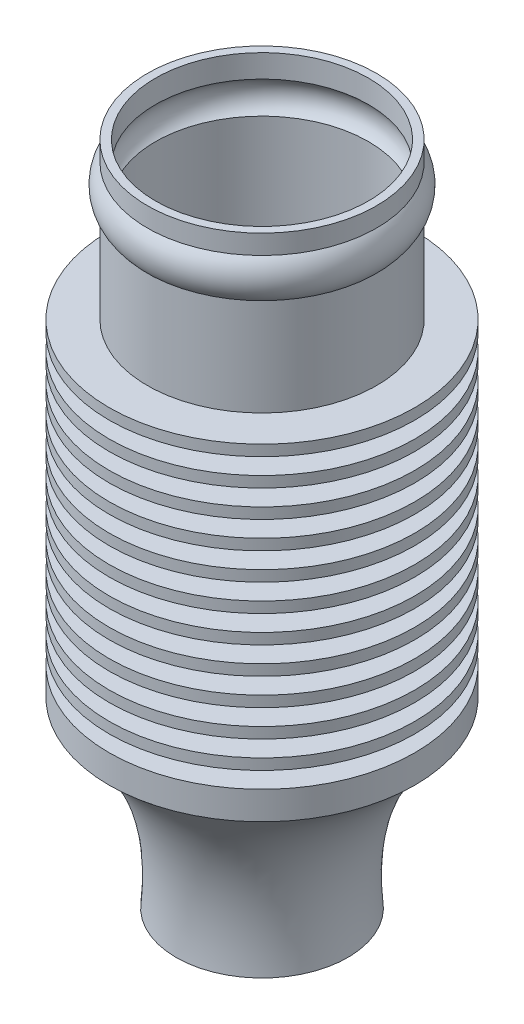
ISO-10303-21;
HEADER;
FILE_DESCRIPTION(('STEP AP214'),'2;1');
FILE_NAME('part.step','',(''),(''),'','','');
FILE_SCHEMA(('AUTOMOTIVE_DESIGN { 1 0 10303 214 1 1 1 1 }'));
ENDSEC;
DATA;
#1=APPLICATION_CONTEXT('core data for automotive mechanical design processes');
#2=APPLICATION_PROTOCOL_DEFINITION('international standard','automotive_design',2000,#1);
#3=PRODUCT_CONTEXT('',#1,'mechanical');
#4=PRODUCT('Part','Part','',(#3));
#5=PRODUCT_RELATED_PRODUCT_CATEGORY('part','',(#4));
#6=PRODUCT_DEFINITION_FORMATION('','',#4);
#7=PRODUCT_DEFINITION_CONTEXT('part definition',#1,'design');
#8=PRODUCT_DEFINITION('design','',#6,#7);
#9=PRODUCT_DEFINITION_SHAPE('','',#8);
#10=(LENGTH_UNIT() NAMED_UNIT(*) SI_UNIT(.MILLI.,.METRE.));
#11=(NAMED_UNIT(*) PLANE_ANGLE_UNIT() SI_UNIT($,.RADIAN.));
#12=(NAMED_UNIT(*) SI_UNIT($,.STERADIAN.) SOLID_ANGLE_UNIT());
#13=UNCERTAINTY_MEASURE_WITH_UNIT(LENGTH_MEASURE(1.E-05),#10,'distance_accuracy_value','');
#14=(GEOMETRIC_REPRESENTATION_CONTEXT(3) GLOBAL_UNCERTAINTY_ASSIGNED_CONTEXT((#13)) GLOBAL_UNIT_ASSIGNED_CONTEXT((#10,
#11,#12)) REPRESENTATION_CONTEXT('',''));
#15=CARTESIAN_POINT('',(0.,0.,0.));
#16=DIRECTION('',(0.,0.,1.));
#17=DIRECTION('',(1.,0.,0.));
#18=AXIS2_PLACEMENT_3D('',#15,#16,#17);
#19=CARTESIAN_POINT('',(0.,0.,0.));
#20=DIRECTION('',(0.,1.,0.));
#21=DIRECTION('',(0.,0.,1.));
#22=AXIS2_PLACEMENT_3D('',#19,#20,#21);
#23=PLANE('',#22);
#24=CARTESIAN_POINT('',(0.,0.,0.));
#25=DIRECTION('',(0.,1.,0.));
#26=DIRECTION('',(0.,0.,1.));
#27=AXIS2_PLACEMENT_3D('',#24,#25,#26);
#28=CIRCLE('',#27,15.8018274363557);
#29=CARTESIAN_POINT('',(0.,0.,15.8018274363557));
#30=VERTEX_POINT('',#29);
#31=EDGE_CURVE('E10',#30,#30,#28,.T.);
#32=ORIENTED_EDGE('',*,*,#31,.F.);
#33=EDGE_LOOP('',(#32));
#34=FACE_BOUND('',#33,.T.);
#35=ADVANCED_FACE('F39',(#34),#23,.F.);
#36=CARTESIAN_POINT('',(15.8018274363557,0.,0.));
#37=CARTESIAN_POINT('',(13.7828030477477,22.3811675355133,0.));
#38=CARTESIAN_POINT('',(28.1218962850397,33.6123617502142,0.));
#39=B_SPLINE_CURVE_WITH_KNOTS('',2,(#36,#37,#38),.UNSPECIFIED.,.F.,.F.,(3,3),(0.,1.),.UNSPECIFIED.);
#40=CARTESIAN_POINT('',(0.,33.6123617502142,0.));
#41=DIRECTION('',(0.,1.,0.));
#42=AXIS1_PLACEMENT('',#40,#41);
#43=SURFACE_OF_REVOLUTION('',#39,#42);
#44=CARTESIAN_POINT('',(0.,33.6123617502142,0.));
#45=DIRECTION('',(0.,1.,0.));
#46=DIRECTION('',(0.,0.,1.));
#47=AXIS2_PLACEMENT_3D('',#44,#45,#46);
#48=CIRCLE('',#47,28.1218962850397);
#49=CARTESIAN_POINT('',(0.,33.6123617502142,28.1218962850397));
#50=VERTEX_POINT('',#49);
#51=EDGE_CURVE('E46',#50,#50,#48,.T.);
#52=ORIENTED_EDGE('',*,*,#51,.F.);
#53=EDGE_LOOP('',(#52));
#54=FACE_BOUND('',#53,.T.);
#55=ORIENTED_EDGE('',*,*,#31,.T.);
#56=EDGE_LOOP('',(#55));
#57=FACE_BOUND('',#56,.T.);
#58=ADVANCED_FACE('F150',(#54,#57),#43,.T.);
#59=CARTESIAN_POINT('',(0.,33.6123617502142,0.));
#60=DIRECTION('',(0.,-1.,0.));
#61=DIRECTION('',(0.,0.,-1.));
#62=AXIS2_PLACEMENT_3D('',#59,#60,#61);
#63=CYLINDRICAL_SURFACE('',#62,28.1218962850397);
#64=CARTESIAN_POINT('',(0.,38.7911166699927,0.));
#65=DIRECTION('',(0.,-1.,0.));
#66=DIRECTION('',(0.,0.,-1.));
#67=AXIS2_PLACEMENT_3D('',#64,#65,#66);
#68=CIRCLE('',#67,28.1218962850397);
#69=CARTESIAN_POINT('',(0.,38.7911166699927,-28.1218962850397));
#70=VERTEX_POINT('',#69);
#71=EDGE_CURVE('E54',#70,#70,#68,.F.);
#72=ORIENTED_EDGE('',*,*,#71,.F.);
#73=EDGE_LOOP('',(#72));
#74=FACE_BOUND('',#73,.T.);
#75=ORIENTED_EDGE('',*,*,#51,.T.);
#76=EDGE_LOOP('',(#75));
#77=FACE_BOUND('',#76,.T.);
#78=ADVANCED_FACE('F133',(#74,#77),#63,.T.);
#79=CARTESIAN_POINT('',(21.0988467211793,41.7911166699927,0.));
#80=DIRECTION('',(0.,1.,0.));
#81=DIRECTION('',(0.,0.,1.));
#82=AXIS2_PLACEMENT_3D('',#79,#80,#81);
#83=PLANE('',#82);
#84=CARTESIAN_POINT('',(0.,41.7911166699927,0.));
#85=DIRECTION('',(0.,1.,0.));
#86=DIRECTION('',(0.,0.,1.));
#87=AXIS2_PLACEMENT_3D('',#84,#85,#86);
#88=CIRCLE('',#87,28.1218962850397);
#89=CARTESIAN_POINT('',(0.,41.7911166699927,28.1218962850397));
#90=VERTEX_POINT('',#89);
#91=EDGE_CURVE('E57',#90,#90,#88,.F.);
#92=ORIENTED_EDGE('',*,*,#91,.T.);
#93=EDGE_LOOP('',(#92));
#94=FACE_BOUND('',#93,.T.);
#95=CARTESIAN_POINT('',(0.,41.7911166699927,0.));
#96=DIRECTION('',(0.,-1.,0.));
#97=DIRECTION('',(0.,0.,-1.));
#98=AXIS2_PLACEMENT_3D('',#95,#96,#97);
#99=CIRCLE('',#98,21.0988467211793);
#100=CARTESIAN_POINT('',(0.,41.7911166699927,-21.0988467211793));
#101=VERTEX_POINT('',#100);
#102=EDGE_CURVE('E194',#101,#101,#99,.T.);
#103=ORIENTED_EDGE('',*,*,#102,.F.);
#104=EDGE_LOOP('',(#103));
#105=FACE_BOUND('',#104,.T.);
#106=ADVANCED_FACE('F149',(#94,#105),#83,.F.);
#107=CARTESIAN_POINT('',(0.,0.,0.));
#108=DIRECTION('',(0.,-1.,0.));
#109=DIRECTION('',(0.,0.,-1.));
#110=AXIS2_PLACEMENT_3D('',#107,#108,#109);
#111=CYLINDRICAL_SURFACE('',#110,21.0988467211793);
#112=CARTESIAN_POINT('',(0.,38.7911166699927,0.));
#113=DIRECTION('',(0.,-1.,0.));
#114=DIRECTION('',(0.,0.,-1.));
#115=AXIS2_PLACEMENT_3D('',#112,#113,#114);
#116=CIRCLE('',#115,21.0988467211793);
#117=CARTESIAN_POINT('',(0.,38.7911166699927,-21.0988467211793));
#118=VERTEX_POINT('',#117);
#119=EDGE_CURVE('E191',#118,#118,#116,.T.);
#120=ORIENTED_EDGE('',*,*,#119,.F.);
#121=EDGE_LOOP('',(#120));
#122=FACE_BOUND('',#121,.T.);
#123=ORIENTED_EDGE('',*,*,#102,.T.);
#124=EDGE_LOOP('',(#123));
#125=FACE_BOUND('',#124,.T.);
#126=ADVANCED_FACE('F279',(#122,#125),#111,.T.);
#127=CARTESIAN_POINT('',(21.0988467211793,38.7911166699927,0.));
#128=DIRECTION('',(0.,-1.,0.));
#129=DIRECTION('',(0.,0.,-1.));
#130=AXIS2_PLACEMENT_3D('',#127,#128,#129);
#131=PLANE('',#130);
#132=ORIENTED_EDGE('',*,*,#71,.T.);
#133=EDGE_LOOP('',(#132));
#134=FACE_BOUND('',#133,.T.);
#135=ORIENTED_EDGE('',*,*,#119,.T.);
#136=EDGE_LOOP('',(#135));
#137=FACE_BOUND('',#136,.T.);
#138=ADVANCED_FACE('F276',(#134,#137),#131,.F.);
#139=CARTESIAN_POINT('',(0.,43.7911166699927,0.));
#140=DIRECTION('',(0.,-1.,0.));
#141=DIRECTION('',(0.,0.,-1.));
#142=AXIS2_PLACEMENT_3D('',#139,#140,#141);
#143=CIRCLE('',#142,28.1218962850397);
#144=CARTESIAN_POINT('',(0.,43.7911166699927,-28.1218962850397));
#145=VERTEX_POINT('',#144);
#146=EDGE_CURVE('E61',#145,#145,#143,.F.);
#147=ORIENTED_EDGE('',*,*,#146,.F.);
#148=EDGE_LOOP('',(#147));
#149=FACE_BOUND('',#148,.T.);
#150=ORIENTED_EDGE('',*,*,#91,.F.);
#151=EDGE_LOOP('',(#150));
#152=FACE_BOUND('',#151,.T.);
#153=ADVANCED_FACE('F152',(#149,#152),#63,.T.);
#154=CARTESIAN_POINT('',(21.0988467211793,46.7911166699927,0.));
#155=DIRECTION('',(0.,1.,0.));
#156=DIRECTION('',(0.,0.,1.));
#157=AXIS2_PLACEMENT_3D('',#154,#155,#156);
#158=PLANE('',#157);
#159=CARTESIAN_POINT('',(0.,46.7911166699927,0.));
#160=DIRECTION('',(0.,1.,0.));
#161=DIRECTION('',(0.,0.,1.));
#162=AXIS2_PLACEMENT_3D('',#159,#160,#161);
#163=CIRCLE('',#162,28.1218962850397);
#164=CARTESIAN_POINT('',(0.,46.7911166699927,28.1218962850397));
#165=VERTEX_POINT('',#164);
#166=EDGE_CURVE('E64',#165,#165,#163,.F.);
#167=ORIENTED_EDGE('',*,*,#166,.T.);
#168=EDGE_LOOP('',(#167));
#169=FACE_BOUND('',#168,.T.);
#170=CARTESIAN_POINT('',(0.,46.7911166699927,0.));
#171=DIRECTION('',(0.,-1.,0.));
#172=DIRECTION('',(0.,0.,-1.));
#173=AXIS2_PLACEMENT_3D('',#170,#171,#172);
#174=CIRCLE('',#173,21.0988467211793);
#175=CARTESIAN_POINT('',(0.,46.7911166699927,-21.0988467211793));
#176=VERTEX_POINT('',#175);
#177=EDGE_CURVE('E200',#176,#176,#174,.T.);
#178=ORIENTED_EDGE('',*,*,#177,.F.);
#179=EDGE_LOOP('',(#178));
#180=FACE_BOUND('',#179,.T.);
#181=ADVANCED_FACE('F295',(#169,#180),#158,.F.);
#182=CARTESIAN_POINT('',(0.,0.,0.));
#183=DIRECTION('',(0.,-1.,0.));
#184=DIRECTION('',(0.,0.,-1.));
#185=AXIS2_PLACEMENT_3D('',#182,#183,#184);
#186=CYLINDRICAL_SURFACE('',#185,21.0988467211793);
#187=CARTESIAN_POINT('',(0.,43.7911166699927,0.));
#188=DIRECTION('',(0.,-1.,0.));
#189=DIRECTION('',(0.,0.,-1.));
#190=AXIS2_PLACEMENT_3D('',#187,#188,#189);
#191=CIRCLE('',#190,21.0988467211793);
#192=CARTESIAN_POINT('',(0.,43.7911166699927,-21.0988467211793));
#193=VERTEX_POINT('',#192);
#194=EDGE_CURVE('E197',#193,#193,#191,.T.);
#195=ORIENTED_EDGE('',*,*,#194,.F.);
#196=EDGE_LOOP('',(#195));
#197=FACE_BOUND('',#196,.T.);
#198=ORIENTED_EDGE('',*,*,#177,.T.);
#199=EDGE_LOOP('',(#198));
#200=FACE_BOUND('',#199,.T.);
#201=ADVANCED_FACE('F291',(#197,#200),#186,.T.);
#202=CARTESIAN_POINT('',(21.0988467211793,43.7911166699927,0.));
#203=DIRECTION('',(0.,-1.,0.));
#204=DIRECTION('',(0.,0.,-1.));
#205=AXIS2_PLACEMENT_3D('',#202,#203,#204);
#206=PLANE('',#205);
#207=ORIENTED_EDGE('',*,*,#146,.T.);
#208=EDGE_LOOP('',(#207));
#209=FACE_BOUND('',#208,.T.);
#210=ORIENTED_EDGE('',*,*,#194,.T.);
#211=EDGE_LOOP('',(#210));
#212=FACE_BOUND('',#211,.T.);
#213=ADVANCED_FACE('F287',(#209,#212),#206,.F.);
#214=CARTESIAN_POINT('',(0.,48.7911166699927,0.));
#215=DIRECTION('',(0.,-1.,0.));
#216=DIRECTION('',(0.,0.,-1.));
#217=AXIS2_PLACEMENT_3D('',#214,#215,#216);
#218=CIRCLE('',#217,28.1218962850397);
#219=CARTESIAN_POINT('',(0.,48.7911166699927,-28.1218962850397));
#220=VERTEX_POINT('',#219);
#221=EDGE_CURVE('E67',#220,#220,#218,.F.);
#222=ORIENTED_EDGE('',*,*,#221,.F.);
#223=EDGE_LOOP('',(#222));
#224=FACE_BOUND('',#223,.T.);
#225=ORIENTED_EDGE('',*,*,#166,.F.);
#226=EDGE_LOOP('',(#225));
#227=FACE_BOUND('',#226,.T.);
#228=ADVANCED_FACE('F290',(#224,#227),#63,.T.);
#229=CARTESIAN_POINT('',(21.0988467211793,51.7911166699927,0.));
#230=DIRECTION('',(0.,1.,0.));
#231=DIRECTION('',(0.,0.,1.));
#232=AXIS2_PLACEMENT_3D('',#229,#230,#231);
#233=PLANE('',#232);
#234=CARTESIAN_POINT('',(0.,51.7911166699927,0.));
#235=DIRECTION('',(0.,1.,0.));
#236=DIRECTION('',(0.,0.,1.));
#237=AXIS2_PLACEMENT_3D('',#234,#235,#236);
#238=CIRCLE('',#237,28.1218962850397);
#239=CARTESIAN_POINT('',(0.,51.7911166699927,28.1218962850397));
#240=VERTEX_POINT('',#239);
#241=EDGE_CURVE('E70',#240,#240,#238,.F.);
#242=ORIENTED_EDGE('',*,*,#241,.T.);
#243=EDGE_LOOP('',(#242));
#244=FACE_BOUND('',#243,.T.);
#245=CARTESIAN_POINT('',(0.,51.7911166699927,0.));
#246=DIRECTION('',(0.,-1.,0.));
#247=DIRECTION('',(0.,0.,-1.));
#248=AXIS2_PLACEMENT_3D('',#245,#246,#247);
#249=CIRCLE('',#248,21.0988467211793);
#250=CARTESIAN_POINT('',(0.,51.7911166699927,-21.0988467211793));
#251=VERTEX_POINT('',#250);
#252=EDGE_CURVE('E206',#251,#251,#249,.T.);
#253=ORIENTED_EDGE('',*,*,#252,.F.);
#254=EDGE_LOOP('',(#253));
#255=FACE_BOUND('',#254,.T.);
#256=ADVANCED_FACE('F308',(#244,#255),#233,.F.);
#257=CARTESIAN_POINT('',(0.,0.,0.));
#258=DIRECTION('',(0.,-1.,0.));
#259=DIRECTION('',(0.,0.,-1.));
#260=AXIS2_PLACEMENT_3D('',#257,#258,#259);
#261=CYLINDRICAL_SURFACE('',#260,21.0988467211793);
#262=CARTESIAN_POINT('',(0.,48.7911166699927,0.));
#263=DIRECTION('',(0.,-1.,0.));
#264=DIRECTION('',(0.,0.,-1.));
#265=AXIS2_PLACEMENT_3D('',#262,#263,#264);
#266=CIRCLE('',#265,21.0988467211793);
#267=CARTESIAN_POINT('',(0.,48.7911166699927,-21.0988467211793));
#268=VERTEX_POINT('',#267);
#269=EDGE_CURVE('E203',#268,#268,#266,.T.);
#270=ORIENTED_EDGE('',*,*,#269,.F.);
#271=EDGE_LOOP('',(#270));
#272=FACE_BOUND('',#271,.T.);
#273=ORIENTED_EDGE('',*,*,#252,.T.);
#274=EDGE_LOOP('',(#273));
#275=FACE_BOUND('',#274,.T.);
#276=ADVANCED_FACE('F304',(#272,#275),#261,.T.);
#277=CARTESIAN_POINT('',(21.0988467211793,48.7911166699927,0.));
#278=DIRECTION('',(0.,-1.,0.));
#279=DIRECTION('',(0.,0.,-1.));
#280=AXIS2_PLACEMENT_3D('',#277,#278,#279);
#281=PLANE('',#280);
#282=ORIENTED_EDGE('',*,*,#221,.T.);
#283=EDGE_LOOP('',(#282));
#284=FACE_BOUND('',#283,.T.);
#285=ORIENTED_EDGE('',*,*,#269,.T.);
#286=EDGE_LOOP('',(#285));
#287=FACE_BOUND('',#286,.T.);
#288=ADVANCED_FACE('F300',(#284,#287),#281,.F.);
#289=CARTESIAN_POINT('',(0.,53.7911166699927,0.));
#290=DIRECTION('',(0.,-1.,0.));
#291=DIRECTION('',(0.,0.,-1.));
#292=AXIS2_PLACEMENT_3D('',#289,#290,#291);
#293=CIRCLE('',#292,28.1218962850397);
#294=CARTESIAN_POINT('',(0.,53.7911166699927,-28.1218962850397));
#295=VERTEX_POINT('',#294);
#296=EDGE_CURVE('E73',#295,#295,#293,.F.);
#297=ORIENTED_EDGE('',*,*,#296,.F.);
#298=EDGE_LOOP('',(#297));
#299=FACE_BOUND('',#298,.T.);
#300=ORIENTED_EDGE('',*,*,#241,.F.);
#301=EDGE_LOOP('',(#300));
#302=FACE_BOUND('',#301,.T.);
#303=ADVANCED_FACE('F303',(#299,#302),#63,.T.);
#304=CARTESIAN_POINT('',(21.0988467211793,56.7911166699927,0.));
#305=DIRECTION('',(0.,1.,0.));
#306=DIRECTION('',(0.,0.,1.));
#307=AXIS2_PLACEMENT_3D('',#304,#305,#306);
#308=PLANE('',#307);
#309=CARTESIAN_POINT('',(0.,56.7911166699927,0.));
#310=DIRECTION('',(0.,1.,0.));
#311=DIRECTION('',(0.,0.,1.));
#312=AXIS2_PLACEMENT_3D('',#309,#310,#311);
#313=CIRCLE('',#312,28.1218962850397);
#314=CARTESIAN_POINT('',(0.,56.7911166699927,28.1218962850397));
#315=VERTEX_POINT('',#314);
#316=EDGE_CURVE('E76',#315,#315,#313,.F.);
#317=ORIENTED_EDGE('',*,*,#316,.T.);
#318=EDGE_LOOP('',(#317));
#319=FACE_BOUND('',#318,.T.);
#320=CARTESIAN_POINT('',(0.,56.7911166699927,0.));
#321=DIRECTION('',(0.,-1.,0.));
#322=DIRECTION('',(0.,0.,-1.));
#323=AXIS2_PLACEMENT_3D('',#320,#321,#322);
#324=CIRCLE('',#323,21.0988467211793);
#325=CARTESIAN_POINT('',(0.,56.7911166699927,-21.0988467211793));
#326=VERTEX_POINT('',#325);
#327=EDGE_CURVE('E212',#326,#326,#324,.T.);
#328=ORIENTED_EDGE('',*,*,#327,.F.);
#329=EDGE_LOOP('',(#328));
#330=FACE_BOUND('',#329,.T.);
#331=ADVANCED_FACE('F321',(#319,#330),#308,.F.);
#332=CARTESIAN_POINT('',(0.,0.,0.));
#333=DIRECTION('',(0.,-1.,0.));
#334=DIRECTION('',(0.,0.,-1.));
#335=AXIS2_PLACEMENT_3D('',#332,#333,#334);
#336=CYLINDRICAL_SURFACE('',#335,21.0988467211793);
#337=CARTESIAN_POINT('',(0.,53.7911166699927,0.));
#338=DIRECTION('',(0.,-1.,0.));
#339=DIRECTION('',(0.,0.,-1.));
#340=AXIS2_PLACEMENT_3D('',#337,#338,#339);
#341=CIRCLE('',#340,21.0988467211793);
#342=CARTESIAN_POINT('',(0.,53.7911166699927,-21.0988467211793));
#343=VERTEX_POINT('',#342);
#344=EDGE_CURVE('E209',#343,#343,#341,.T.);
#345=ORIENTED_EDGE('',*,*,#344,.F.);
#346=EDGE_LOOP('',(#345));
#347=FACE_BOUND('',#346,.T.);
#348=ORIENTED_EDGE('',*,*,#327,.T.);
#349=EDGE_LOOP('',(#348));
#350=FACE_BOUND('',#349,.T.);
#351=ADVANCED_FACE('F317',(#347,#350),#336,.T.);
#352=CARTESIAN_POINT('',(21.0988467211793,53.7911166699927,0.));
#353=DIRECTION('',(0.,-1.,0.));
#354=DIRECTION('',(0.,0.,-1.));
#355=AXIS2_PLACEMENT_3D('',#352,#353,#354);
#356=PLANE('',#355);
#357=ORIENTED_EDGE('',*,*,#296,.T.);
#358=EDGE_LOOP('',(#357));
#359=FACE_BOUND('',#358,.T.);
#360=ORIENTED_EDGE('',*,*,#344,.T.);
#361=EDGE_LOOP('',(#360));
#362=FACE_BOUND('',#361,.T.);
#363=ADVANCED_FACE('F313',(#359,#362),#356,.F.);
#364=CARTESIAN_POINT('',(0.,58.7911166699927,0.));
#365=DIRECTION('',(0.,-1.,0.));
#366=DIRECTION('',(0.,0.,-1.));
#367=AXIS2_PLACEMENT_3D('',#364,#365,#366);
#368=CIRCLE('',#367,28.1218962850397);
#369=CARTESIAN_POINT('',(0.,58.7911166699927,-28.1218962850397));
#370=VERTEX_POINT('',#369);
#371=EDGE_CURVE('E79',#370,#370,#368,.F.);
#372=ORIENTED_EDGE('',*,*,#371,.F.);
#373=EDGE_LOOP('',(#372));
#374=FACE_BOUND('',#373,.T.);
#375=ORIENTED_EDGE('',*,*,#316,.F.);
#376=EDGE_LOOP('',(#375));
#377=FACE_BOUND('',#376,.T.);
#378=ADVANCED_FACE('F316',(#374,#377),#63,.T.);
#379=CARTESIAN_POINT('',(21.0988467211793,61.7911166699927,0.));
#380=DIRECTION('',(0.,1.,0.));
#381=DIRECTION('',(0.,0.,1.));
#382=AXIS2_PLACEMENT_3D('',#379,#380,#381);
#383=PLANE('',#382);
#384=CARTESIAN_POINT('',(0.,61.7911166699927,0.));
#385=DIRECTION('',(0.,1.,0.));
#386=DIRECTION('',(0.,0.,1.));
#387=AXIS2_PLACEMENT_3D('',#384,#385,#386);
#388=CIRCLE('',#387,28.1218962850397);
#389=CARTESIAN_POINT('',(0.,61.7911166699927,28.1218962850397));
#390=VERTEX_POINT('',#389);
#391=EDGE_CURVE('E82',#390,#390,#388,.F.);
#392=ORIENTED_EDGE('',*,*,#391,.T.);
#393=EDGE_LOOP('',(#392));
#394=FACE_BOUND('',#393,.T.);
#395=CARTESIAN_POINT('',(0.,61.7911166699927,0.));
#396=DIRECTION('',(0.,-1.,0.));
#397=DIRECTION('',(0.,0.,-1.));
#398=AXIS2_PLACEMENT_3D('',#395,#396,#397);
#399=CIRCLE('',#398,21.0988467211793);
#400=CARTESIAN_POINT('',(0.,61.7911166699927,-21.0988467211793));
#401=VERTEX_POINT('',#400);
#402=EDGE_CURVE('E218',#401,#401,#399,.T.);
#403=ORIENTED_EDGE('',*,*,#402,.F.);
#404=EDGE_LOOP('',(#403));
#405=FACE_BOUND('',#404,.T.);
#406=ADVANCED_FACE('F334',(#394,#405),#383,.F.);
#407=CARTESIAN_POINT('',(0.,0.,0.));
#408=DIRECTION('',(0.,-1.,0.));
#409=DIRECTION('',(0.,0.,-1.));
#410=AXIS2_PLACEMENT_3D('',#407,#408,#409);
#411=CYLINDRICAL_SURFACE('',#410,21.0988467211793);
#412=CARTESIAN_POINT('',(0.,58.7911166699927,0.));
#413=DIRECTION('',(0.,-1.,0.));
#414=DIRECTION('',(0.,0.,-1.));
#415=AXIS2_PLACEMENT_3D('',#412,#413,#414);
#416=CIRCLE('',#415,21.0988467211793);
#417=CARTESIAN_POINT('',(0.,58.7911166699927,-21.0988467211793));
#418=VERTEX_POINT('',#417);
#419=EDGE_CURVE('E215',#418,#418,#416,.T.);
#420=ORIENTED_EDGE('',*,*,#419,.F.);
#421=EDGE_LOOP('',(#420));
#422=FACE_BOUND('',#421,.T.);
#423=ORIENTED_EDGE('',*,*,#402,.T.);
#424=EDGE_LOOP('',(#423));
#425=FACE_BOUND('',#424,.T.);
#426=ADVANCED_FACE('F330',(#422,#425),#411,.T.);
#427=CARTESIAN_POINT('',(21.0988467211793,58.7911166699927,0.));
#428=DIRECTION('',(0.,-1.,0.));
#429=DIRECTION('',(0.,0.,-1.));
#430=AXIS2_PLACEMENT_3D('',#427,#428,#429);
#431=PLANE('',#430);
#432=ORIENTED_EDGE('',*,*,#371,.T.);
#433=EDGE_LOOP('',(#432));
#434=FACE_BOUND('',#433,.T.);
#435=ORIENTED_EDGE('',*,*,#419,.T.);
#436=EDGE_LOOP('',(#435));
#437=FACE_BOUND('',#436,.T.);
#438=ADVANCED_FACE('F326',(#434,#437),#431,.F.);
#439=CARTESIAN_POINT('',(0.,63.7911166699927,0.));
#440=DIRECTION('',(0.,-1.,0.));
#441=DIRECTION('',(0.,0.,-1.));
#442=AXIS2_PLACEMENT_3D('',#439,#440,#441);
#443=CIRCLE('',#442,28.1218962850397);
#444=CARTESIAN_POINT('',(0.,63.7911166699927,-28.1218962850397));
#445=VERTEX_POINT('',#444);
#446=EDGE_CURVE('E85',#445,#445,#443,.F.);
#447=ORIENTED_EDGE('',*,*,#446,.F.);
#448=EDGE_LOOP('',(#447));
#449=FACE_BOUND('',#448,.T.);
#450=ORIENTED_EDGE('',*,*,#391,.F.);
#451=EDGE_LOOP('',(#450));
#452=FACE_BOUND('',#451,.T.);
#453=ADVANCED_FACE('F329',(#449,#452),#63,.T.);
#454=CARTESIAN_POINT('',(21.0988467211793,66.7911166699927,0.));
#455=DIRECTION('',(0.,1.,0.));
#456=DIRECTION('',(0.,0.,1.));
#457=AXIS2_PLACEMENT_3D('',#454,#455,#456);
#458=PLANE('',#457);
#459=CARTESIAN_POINT('',(0.,66.7911166699927,0.));
#460=DIRECTION('',(0.,1.,0.));
#461=DIRECTION('',(0.,0.,1.));
#462=AXIS2_PLACEMENT_3D('',#459,#460,#461);
#463=CIRCLE('',#462,28.1218962850397);
#464=CARTESIAN_POINT('',(0.,66.7911166699927,28.1218962850397));
#465=VERTEX_POINT('',#464);
#466=EDGE_CURVE('E88',#465,#465,#463,.F.);
#467=ORIENTED_EDGE('',*,*,#466,.T.);
#468=EDGE_LOOP('',(#467));
#469=FACE_BOUND('',#468,.T.);
#470=CARTESIAN_POINT('',(0.,66.7911166699927,0.));
#471=DIRECTION('',(0.,-1.,0.));
#472=DIRECTION('',(0.,0.,-1.));
#473=AXIS2_PLACEMENT_3D('',#470,#471,#472);
#474=CIRCLE('',#473,21.0988467211793);
#475=CARTESIAN_POINT('',(0.,66.7911166699927,-21.0988467211793));
#476=VERTEX_POINT('',#475);
#477=EDGE_CURVE('E224',#476,#476,#474,.T.);
#478=ORIENTED_EDGE('',*,*,#477,.F.);
#479=EDGE_LOOP('',(#478));
#480=FACE_BOUND('',#479,.T.);
#481=ADVANCED_FACE('F347',(#469,#480),#458,.F.);
#482=CARTESIAN_POINT('',(0.,0.,0.));
#483=DIRECTION('',(0.,-1.,0.));
#484=DIRECTION('',(0.,0.,-1.));
#485=AXIS2_PLACEMENT_3D('',#482,#483,#484);
#486=CYLINDRICAL_SURFACE('',#485,21.0988467211793);
#487=CARTESIAN_POINT('',(0.,63.7911166699927,0.));
#488=DIRECTION('',(0.,-1.,0.));
#489=DIRECTION('',(0.,0.,-1.));
#490=AXIS2_PLACEMENT_3D('',#487,#488,#489);
#491=CIRCLE('',#490,21.0988467211793);
#492=CARTESIAN_POINT('',(0.,63.7911166699927,-21.0988467211793));
#493=VERTEX_POINT('',#492);
#494=EDGE_CURVE('E221',#493,#493,#491,.T.);
#495=ORIENTED_EDGE('',*,*,#494,.F.);
#496=EDGE_LOOP('',(#495));
#497=FACE_BOUND('',#496,.T.);
#498=ORIENTED_EDGE('',*,*,#477,.T.);
#499=EDGE_LOOP('',(#498));
#500=FACE_BOUND('',#499,.T.);
#501=ADVANCED_FACE('F343',(#497,#500),#486,.T.);
#502=CARTESIAN_POINT('',(21.0988467211793,63.7911166699927,0.));
#503=DIRECTION('',(0.,-1.,0.));
#504=DIRECTION('',(0.,0.,-1.));
#505=AXIS2_PLACEMENT_3D('',#502,#503,#504);
#506=PLANE('',#505);
#507=ORIENTED_EDGE('',*,*,#446,.T.);
#508=EDGE_LOOP('',(#507));
#509=FACE_BOUND('',#508,.T.);
#510=ORIENTED_EDGE('',*,*,#494,.T.);
#511=EDGE_LOOP('',(#510));
#512=FACE_BOUND('',#511,.T.);
#513=ADVANCED_FACE('F339',(#509,#512),#506,.F.);
#514=CARTESIAN_POINT('',(0.,68.7911166699927,0.));
#515=DIRECTION('',(0.,-1.,0.));
#516=DIRECTION('',(0.,0.,-1.));
#517=AXIS2_PLACEMENT_3D('',#514,#515,#516);
#518=CIRCLE('',#517,28.1218962850397);
#519=CARTESIAN_POINT('',(0.,68.7911166699927,-28.1218962850397));
#520=VERTEX_POINT('',#519);
#521=EDGE_CURVE('E91',#520,#520,#518,.F.);
#522=ORIENTED_EDGE('',*,*,#521,.F.);
#523=EDGE_LOOP('',(#522));
#524=FACE_BOUND('',#523,.T.);
#525=ORIENTED_EDGE('',*,*,#466,.F.);
#526=EDGE_LOOP('',(#525));
#527=FACE_BOUND('',#526,.T.);
#528=ADVANCED_FACE('F342',(#524,#527),#63,.T.);
#529=CARTESIAN_POINT('',(21.0988467211793,71.7911166699927,0.));
#530=DIRECTION('',(0.,1.,0.));
#531=DIRECTION('',(0.,0.,1.));
#532=AXIS2_PLACEMENT_3D('',#529,#530,#531);
#533=PLANE('',#532);
#534=CARTESIAN_POINT('',(0.,71.7911166699927,0.));
#535=DIRECTION('',(0.,1.,0.));
#536=DIRECTION('',(0.,0.,1.));
#537=AXIS2_PLACEMENT_3D('',#534,#535,#536);
#538=CIRCLE('',#537,28.1218962850397);
#539=CARTESIAN_POINT('',(0.,71.7911166699927,28.1218962850397));
#540=VERTEX_POINT('',#539);
#541=EDGE_CURVE('E94',#540,#540,#538,.F.);
#542=ORIENTED_EDGE('',*,*,#541,.T.);
#543=EDGE_LOOP('',(#542));
#544=FACE_BOUND('',#543,.T.);
#545=CARTESIAN_POINT('',(0.,71.7911166699927,0.));
#546=DIRECTION('',(0.,-1.,0.));
#547=DIRECTION('',(0.,0.,-1.));
#548=AXIS2_PLACEMENT_3D('',#545,#546,#547);
#549=CIRCLE('',#548,21.0988467211793);
#550=CARTESIAN_POINT('',(0.,71.7911166699927,-21.0988467211793));
#551=VERTEX_POINT('',#550);
#552=EDGE_CURVE('E230',#551,#551,#549,.T.);
#553=ORIENTED_EDGE('',*,*,#552,.F.);
#554=EDGE_LOOP('',(#553));
#555=FACE_BOUND('',#554,.T.);
#556=ADVANCED_FACE('F360',(#544,#555),#533,.F.);
#557=CARTESIAN_POINT('',(0.,0.,0.));
#558=DIRECTION('',(0.,-1.,0.));
#559=DIRECTION('',(0.,0.,-1.));
#560=AXIS2_PLACEMENT_3D('',#557,#558,#559);
#561=CYLINDRICAL_SURFACE('',#560,21.0988467211793);
#562=CARTESIAN_POINT('',(0.,68.7911166699927,0.));
#563=DIRECTION('',(0.,-1.,0.));
#564=DIRECTION('',(0.,0.,-1.));
#565=AXIS2_PLACEMENT_3D('',#562,#563,#564);
#566=CIRCLE('',#565,21.0988467211793);
#567=CARTESIAN_POINT('',(0.,68.7911166699927,-21.0988467211793));
#568=VERTEX_POINT('',#567);
#569=EDGE_CURVE('E227',#568,#568,#566,.T.);
#570=ORIENTED_EDGE('',*,*,#569,.F.);
#571=EDGE_LOOP('',(#570));
#572=FACE_BOUND('',#571,.T.);
#573=ORIENTED_EDGE('',*,*,#552,.T.);
#574=EDGE_LOOP('',(#573));
#575=FACE_BOUND('',#574,.T.);
#576=ADVANCED_FACE('F356',(#572,#575),#561,.T.);
#577=CARTESIAN_POINT('',(21.0988467211793,68.7911166699927,0.));
#578=DIRECTION('',(0.,-1.,0.));
#579=DIRECTION('',(0.,0.,-1.));
#580=AXIS2_PLACEMENT_3D('',#577,#578,#579);
#581=PLANE('',#580);
#582=ORIENTED_EDGE('',*,*,#521,.T.);
#583=EDGE_LOOP('',(#582));
#584=FACE_BOUND('',#583,.T.);
#585=ORIENTED_EDGE('',*,*,#569,.T.);
#586=EDGE_LOOP('',(#585));
#587=FACE_BOUND('',#586,.T.);
#588=ADVANCED_FACE('F352',(#584,#587),#581,.F.);
#589=CARTESIAN_POINT('',(0.,73.7911166699927,0.));
#590=DIRECTION('',(0.,-1.,0.));
#591=DIRECTION('',(0.,0.,-1.));
#592=AXIS2_PLACEMENT_3D('',#589,#590,#591);
#593=CIRCLE('',#592,28.1218962850397);
#594=CARTESIAN_POINT('',(0.,73.7911166699927,-28.1218962850397));
#595=VERTEX_POINT('',#594);
#596=EDGE_CURVE('E97',#595,#595,#593,.F.);
#597=ORIENTED_EDGE('',*,*,#596,.F.);
#598=EDGE_LOOP('',(#597));
#599=FACE_BOUND('',#598,.T.);
#600=ORIENTED_EDGE('',*,*,#541,.F.);
#601=EDGE_LOOP('',(#600));
#602=FACE_BOUND('',#601,.T.);
#603=ADVANCED_FACE('F355',(#599,#602),#63,.T.);
#604=CARTESIAN_POINT('',(21.0988467211793,76.7911166699927,0.));
#605=DIRECTION('',(0.,1.,0.));
#606=DIRECTION('',(0.,0.,1.));
#607=AXIS2_PLACEMENT_3D('',#604,#605,#606);
#608=PLANE('',#607);
#609=CARTESIAN_POINT('',(0.,76.7911166699927,0.));
#610=DIRECTION('',(0.,1.,0.));
#611=DIRECTION('',(0.,0.,1.));
#612=AXIS2_PLACEMENT_3D('',#609,#610,#611);
#613=CIRCLE('',#612,28.1218962850397);
#614=CARTESIAN_POINT('',(0.,76.7911166699927,28.1218962850397));
#615=VERTEX_POINT('',#614);
#616=EDGE_CURVE('E100',#615,#615,#613,.F.);
#617=ORIENTED_EDGE('',*,*,#616,.T.);
#618=EDGE_LOOP('',(#617));
#619=FACE_BOUND('',#618,.T.);
#620=CARTESIAN_POINT('',(0.,76.7911166699927,0.));
#621=DIRECTION('',(0.,-1.,0.));
#622=DIRECTION('',(0.,0.,-1.));
#623=AXIS2_PLACEMENT_3D('',#620,#621,#622);
#624=CIRCLE('',#623,21.0988467211793);
#625=CARTESIAN_POINT('',(0.,76.7911166699927,-21.0988467211793));
#626=VERTEX_POINT('',#625);
#627=EDGE_CURVE('E236',#626,#626,#624,.T.);
#628=ORIENTED_EDGE('',*,*,#627,.F.);
#629=EDGE_LOOP('',(#628));
#630=FACE_BOUND('',#629,.T.);
#631=ADVANCED_FACE('F373',(#619,#630),#608,.F.);
#632=CARTESIAN_POINT('',(0.,0.,0.));
#633=DIRECTION('',(0.,-1.,0.));
#634=DIRECTION('',(0.,0.,-1.));
#635=AXIS2_PLACEMENT_3D('',#632,#633,#634);
#636=CYLINDRICAL_SURFACE('',#635,21.0988467211793);
#637=CARTESIAN_POINT('',(0.,73.7911166699927,0.));
#638=DIRECTION('',(0.,-1.,0.));
#639=DIRECTION('',(0.,0.,-1.));
#640=AXIS2_PLACEMENT_3D('',#637,#638,#639);
#641=CIRCLE('',#640,21.0988467211793);
#642=CARTESIAN_POINT('',(0.,73.7911166699927,-21.0988467211793));
#643=VERTEX_POINT('',#642);
#644=EDGE_CURVE('E233',#643,#643,#641,.T.);
#645=ORIENTED_EDGE('',*,*,#644,.F.);
#646=EDGE_LOOP('',(#645));
#647=FACE_BOUND('',#646,.T.);
#648=ORIENTED_EDGE('',*,*,#627,.T.);
#649=EDGE_LOOP('',(#648));
#650=FACE_BOUND('',#649,.T.);
#651=ADVANCED_FACE('F369',(#647,#650),#636,.T.);
#652=CARTESIAN_POINT('',(21.0988467211793,73.7911166699927,0.));
#653=DIRECTION('',(0.,-1.,0.));
#654=DIRECTION('',(0.,0.,-1.));
#655=AXIS2_PLACEMENT_3D('',#652,#653,#654);
#656=PLANE('',#655);
#657=ORIENTED_EDGE('',*,*,#596,.T.);
#658=EDGE_LOOP('',(#657));
#659=FACE_BOUND('',#658,.T.);
#660=ORIENTED_EDGE('',*,*,#644,.T.);
#661=EDGE_LOOP('',(#660));
#662=FACE_BOUND('',#661,.T.);
#663=ADVANCED_FACE('F365',(#659,#662),#656,.F.);
#664=CARTESIAN_POINT('',(0.,78.7911166699927,0.));
#665=DIRECTION('',(0.,-1.,0.));
#666=DIRECTION('',(0.,0.,-1.));
#667=AXIS2_PLACEMENT_3D('',#664,#665,#666);
#668=CIRCLE('',#667,28.1218962850397);
#669=CARTESIAN_POINT('',(0.,78.7911166699927,-28.1218962850397));
#670=VERTEX_POINT('',#669);
#671=EDGE_CURVE('E103',#670,#670,#668,.F.);
#672=ORIENTED_EDGE('',*,*,#671,.F.);
#673=EDGE_LOOP('',(#672));
#674=FACE_BOUND('',#673,.T.);
#675=ORIENTED_EDGE('',*,*,#616,.F.);
#676=EDGE_LOOP('',(#675));
#677=FACE_BOUND('',#676,.T.);
#678=ADVANCED_FACE('F368',(#674,#677),#63,.T.);
#679=CARTESIAN_POINT('',(21.0988467211793,81.7911166699927,0.));
#680=DIRECTION('',(0.,1.,0.));
#681=DIRECTION('',(0.,0.,1.));
#682=AXIS2_PLACEMENT_3D('',#679,#680,#681);
#683=PLANE('',#682);
#684=CARTESIAN_POINT('',(0.,81.7911166699927,0.));
#685=DIRECTION('',(0.,1.,0.));
#686=DIRECTION('',(0.,0.,1.));
#687=AXIS2_PLACEMENT_3D('',#684,#685,#686);
#688=CIRCLE('',#687,28.1218962850397);
#689=CARTESIAN_POINT('',(0.,81.7911166699927,28.1218962850397));
#690=VERTEX_POINT('',#689);
#691=EDGE_CURVE('E106',#690,#690,#688,.F.);
#692=ORIENTED_EDGE('',*,*,#691,.T.);
#693=EDGE_LOOP('',(#692));
#694=FACE_BOUND('',#693,.T.);
#695=CARTESIAN_POINT('',(0.,81.7911166699927,0.));
#696=DIRECTION('',(0.,-1.,0.));
#697=DIRECTION('',(0.,0.,-1.));
#698=AXIS2_PLACEMENT_3D('',#695,#696,#697);
#699=CIRCLE('',#698,21.0988467211793);
#700=CARTESIAN_POINT('',(0.,81.7911166699927,-21.0988467211793));
#701=VERTEX_POINT('',#700);
#702=EDGE_CURVE('E242',#701,#701,#699,.T.);
#703=ORIENTED_EDGE('',*,*,#702,.F.);
#704=EDGE_LOOP('',(#703));
#705=FACE_BOUND('',#704,.T.);
#706=ADVANCED_FACE('F385',(#694,#705),#683,.F.);
#707=CARTESIAN_POINT('',(0.,0.,0.));
#708=DIRECTION('',(0.,-1.,0.));
#709=DIRECTION('',(0.,0.,-1.));
#710=AXIS2_PLACEMENT_3D('',#707,#708,#709);
#711=CYLINDRICAL_SURFACE('',#710,21.0988467211793);
#712=CARTESIAN_POINT('',(0.,78.7911166699927,0.));
#713=DIRECTION('',(0.,-1.,0.));
#714=DIRECTION('',(0.,0.,-1.));
#715=AXIS2_PLACEMENT_3D('',#712,#713,#714);
#716=CIRCLE('',#715,21.0988467211793);
#717=CARTESIAN_POINT('',(0.,78.7911166699927,-21.0988467211793));
#718=VERTEX_POINT('',#717);
#719=EDGE_CURVE('E239',#718,#718,#716,.T.);
#720=ORIENTED_EDGE('',*,*,#719,.F.);
#721=EDGE_LOOP('',(#720));
#722=FACE_BOUND('',#721,.T.);
#723=ORIENTED_EDGE('',*,*,#702,.T.);
#724=EDGE_LOOP('',(#723));
#725=FACE_BOUND('',#724,.T.);
#726=ADVANCED_FACE('F381',(#722,#725),#711,.T.);
#727=CARTESIAN_POINT('',(21.0988467211793,78.7911166699927,0.));
#728=DIRECTION('',(0.,-1.,0.));
#729=DIRECTION('',(0.,0.,-1.));
#730=AXIS2_PLACEMENT_3D('',#727,#728,#729);
#731=PLANE('',#730);
#732=ORIENTED_EDGE('',*,*,#671,.T.);
#733=EDGE_LOOP('',(#732));
#734=FACE_BOUND('',#733,.T.);
#735=ORIENTED_EDGE('',*,*,#719,.T.);
#736=EDGE_LOOP('',(#735));
#737=FACE_BOUND('',#736,.T.);
#738=ADVANCED_FACE('F378',(#734,#737),#731,.F.);
#739=CARTESIAN_POINT('',(0.,83.7911166699927,0.));
#740=DIRECTION('',(0.,-1.,0.));
#741=DIRECTION('',(0.,0.,-1.));
#742=AXIS2_PLACEMENT_3D('',#739,#740,#741);
#743=CIRCLE('',#742,28.1218962850397);
#744=CARTESIAN_POINT('',(0.,83.7911166699927,-28.1218962850397));
#745=VERTEX_POINT('',#744);
#746=EDGE_CURVE('E109',#745,#745,#743,.F.);
#747=ORIENTED_EDGE('',*,*,#746,.F.);
#748=EDGE_LOOP('',(#747));
#749=FACE_BOUND('',#748,.T.);
#750=ORIENTED_EDGE('',*,*,#691,.F.);
#751=EDGE_LOOP('',(#750));
#752=FACE_BOUND('',#751,.T.);
#753=ADVANCED_FACE('F147',(#749,#752),#63,.T.);
#754=CARTESIAN_POINT('',(21.0988467211793,86.7911166699927,0.));
#755=DIRECTION('',(0.,1.,0.));
#756=DIRECTION('',(0.,0.,1.));
#757=AXIS2_PLACEMENT_3D('',#754,#755,#756);
#758=PLANE('',#757);
#759=CARTESIAN_POINT('',(0.,86.7911166699927,0.));
#760=DIRECTION('',(0.,1.,0.));
#761=DIRECTION('',(0.,0.,1.));
#762=AXIS2_PLACEMENT_3D('',#759,#760,#761);
#763=CIRCLE('',#762,28.1218962850397);
#764=CARTESIAN_POINT('',(0.,86.7911166699927,28.1218962850397));
#765=VERTEX_POINT('',#764);
#766=EDGE_CURVE('E112',#765,#765,#763,.F.);
#767=ORIENTED_EDGE('',*,*,#766,.T.);
#768=EDGE_LOOP('',(#767));
#769=FACE_BOUND('',#768,.T.);
#770=CARTESIAN_POINT('',(0.,86.7911166699927,0.));
#771=DIRECTION('',(0.,-1.,0.));
#772=DIRECTION('',(0.,0.,-1.));
#773=AXIS2_PLACEMENT_3D('',#770,#771,#772);
#774=CIRCLE('',#773,21.0988467211793);
#775=CARTESIAN_POINT('',(0.,86.7911166699927,-21.0988467211793));
#776=VERTEX_POINT('',#775);
#777=EDGE_CURVE('E248',#776,#776,#774,.T.);
#778=ORIENTED_EDGE('',*,*,#777,.F.);
#779=EDGE_LOOP('',(#778));
#780=FACE_BOUND('',#779,.T.);
#781=ADVANCED_FACE('F396',(#769,#780),#758,.F.);
#782=CARTESIAN_POINT('',(0.,0.,0.));
#783=DIRECTION('',(0.,-1.,0.));
#784=DIRECTION('',(0.,0.,-1.));
#785=AXIS2_PLACEMENT_3D('',#782,#783,#784);
#786=CYLINDRICAL_SURFACE('',#785,21.0988467211793);
#787=CARTESIAN_POINT('',(0.,83.7911166699927,0.));
#788=DIRECTION('',(0.,-1.,0.));
#789=DIRECTION('',(0.,0.,-1.));
#790=AXIS2_PLACEMENT_3D('',#787,#788,#789);
#791=CIRCLE('',#790,21.0988467211793);
#792=CARTESIAN_POINT('',(0.,83.7911166699927,-21.0988467211793));
#793=VERTEX_POINT('',#792);
#794=EDGE_CURVE('E245',#793,#793,#791,.T.);
#795=ORIENTED_EDGE('',*,*,#794,.F.);
#796=EDGE_LOOP('',(#795));
#797=FACE_BOUND('',#796,.T.);
#798=ORIENTED_EDGE('',*,*,#777,.T.);
#799=EDGE_LOOP('',(#798));
#800=FACE_BOUND('',#799,.T.);
#801=ADVANCED_FACE('F392',(#797,#800),#786,.T.);
#802=CARTESIAN_POINT('',(21.0988467211793,83.7911166699927,0.));
#803=DIRECTION('',(0.,-1.,0.));
#804=DIRECTION('',(0.,0.,-1.));
#805=AXIS2_PLACEMENT_3D('',#802,#803,#804);
#806=PLANE('',#805);
#807=ORIENTED_EDGE('',*,*,#746,.T.);
#808=EDGE_LOOP('',(#807));
#809=FACE_BOUND('',#808,.T.);
#810=ORIENTED_EDGE('',*,*,#794,.T.);
#811=EDGE_LOOP('',(#810));
#812=FACE_BOUND('',#811,.T.);
#813=ADVANCED_FACE('F145',(#809,#812),#806,.F.);
#814=CARTESIAN_POINT('',(0.,88.7911166699927,0.));
#815=DIRECTION('',(0.,-1.,0.));
#816=DIRECTION('',(0.,0.,-1.));
#817=AXIS2_PLACEMENT_3D('',#814,#815,#816);
#818=CIRCLE('',#817,28.1218962850397);
#819=CARTESIAN_POINT('',(0.,88.7911166699927,-28.1218962850397));
#820=VERTEX_POINT('',#819);
#821=EDGE_CURVE('E115',#820,#820,#818,.F.);
#822=ORIENTED_EDGE('',*,*,#821,.F.);
#823=EDGE_LOOP('',(#822));
#824=FACE_BOUND('',#823,.T.);
#825=ORIENTED_EDGE('',*,*,#766,.F.);
#826=EDGE_LOOP('',(#825));
#827=FACE_BOUND('',#826,.T.);
#828=ADVANCED_FACE('F132',(#824,#827),#63,.T.);
#829=CARTESIAN_POINT('',(21.0988467211793,91.7911166699927,0.));
#830=DIRECTION('',(0.,1.,0.));
#831=DIRECTION('',(0.,0.,1.));
#832=AXIS2_PLACEMENT_3D('',#829,#830,#831);
#833=PLANE('',#832);
#834=CARTESIAN_POINT('',(0.,91.7911166699927,0.));
#835=DIRECTION('',(0.,1.,0.));
#836=DIRECTION('',(0.,0.,1.));
#837=AXIS2_PLACEMENT_3D('',#834,#835,#836);
#838=CIRCLE('',#837,28.1218962850397);
#839=CARTESIAN_POINT('',(0.,91.7911166699927,28.1218962850397));
#840=VERTEX_POINT('',#839);
#841=EDGE_CURVE('E117',#840,#840,#838,.F.);
#842=ORIENTED_EDGE('',*,*,#841,.T.);
#843=EDGE_LOOP('',(#842));
#844=FACE_BOUND('',#843,.T.);
#845=CARTESIAN_POINT('',(0.,91.7911166699927,0.));
#846=DIRECTION('',(0.,-1.,0.));
#847=DIRECTION('',(0.,0.,-1.));
#848=AXIS2_PLACEMENT_3D('',#845,#846,#847);
#849=CIRCLE('',#848,21.0988467211793);
#850=CARTESIAN_POINT('',(0.,91.7911166699927,-21.0988467211793));
#851=VERTEX_POINT('',#850);
#852=EDGE_CURVE('E254',#851,#851,#849,.T.);
#853=ORIENTED_EDGE('',*,*,#852,.F.);
#854=EDGE_LOOP('',(#853));
#855=FACE_BOUND('',#854,.T.);
#856=ADVANCED_FACE('F144',(#844,#855),#833,.F.);
#857=CARTESIAN_POINT('',(0.,0.,0.));
#858=DIRECTION('',(0.,-1.,0.));
#859=DIRECTION('',(0.,0.,-1.));
#860=AXIS2_PLACEMENT_3D('',#857,#858,#859);
#861=CYLINDRICAL_SURFACE('',#860,21.0988467211793);
#862=CARTESIAN_POINT('',(0.,88.7911166699927,0.));
#863=DIRECTION('',(0.,-1.,0.));
#864=DIRECTION('',(0.,0.,-1.));
#865=AXIS2_PLACEMENT_3D('',#862,#863,#864);
#866=CIRCLE('',#865,21.0988467211793);
#867=CARTESIAN_POINT('',(0.,88.7911166699927,-21.0988467211793));
#868=VERTEX_POINT('',#867);
#869=EDGE_CURVE('E251',#868,#868,#866,.T.);
#870=ORIENTED_EDGE('',*,*,#869,.F.);
#871=EDGE_LOOP('',(#870));
#872=FACE_BOUND('',#871,.T.);
#873=ORIENTED_EDGE('',*,*,#852,.T.);
#874=EDGE_LOOP('',(#873));
#875=FACE_BOUND('',#874,.T.);
#876=ADVANCED_FACE('F140',(#872,#875),#861,.T.);
#877=CARTESIAN_POINT('',(21.0988467211793,88.7911166699927,0.));
#878=DIRECTION('',(0.,-1.,0.));
#879=DIRECTION('',(0.,0.,-1.));
#880=AXIS2_PLACEMENT_3D('',#877,#878,#879);
#881=PLANE('',#880);
#882=ORIENTED_EDGE('',*,*,#821,.T.);
#883=EDGE_LOOP('',(#882));
#884=FACE_BOUND('',#883,.T.);
#885=ORIENTED_EDGE('',*,*,#869,.T.);
#886=EDGE_LOOP('',(#885));
#887=FACE_BOUND('',#886,.T.);
#888=ADVANCED_FACE('F131',(#884,#887),#881,.F.);
#889=CARTESIAN_POINT('',(0.,93.7911166699927,0.));
#890=DIRECTION('',(0.,-1.,0.));
#891=DIRECTION('',(0.,0.,-1.));
#892=AXIS2_PLACEMENT_3D('',#889,#890,#891);
#893=CIRCLE('',#892,28.1218962850397);
#894=CARTESIAN_POINT('',(0.,93.7911166699927,-28.1218962850397));
#895=VERTEX_POINT('',#894);
#896=EDGE_CURVE('E42',#895,#895,#893,.F.);
#897=ORIENTED_EDGE('',*,*,#896,.F.);
#898=EDGE_LOOP('',(#897));
#899=FACE_BOUND('',#898,.T.);
#900=ORIENTED_EDGE('',*,*,#841,.F.);
#901=EDGE_LOOP('',(#900));
#902=FACE_BOUND('',#901,.T.);
#903=ADVANCED_FACE('F127',(#899,#902),#63,.T.);
#904=CARTESIAN_POINT('',(0.,0.,0.));
#905=DIRECTION('',(0.,-1.,0.));
#906=DIRECTION('',(0.,0.,-1.));
#907=AXIS2_PLACEMENT_3D('',#904,#905,#906);
#908=CYLINDRICAL_SURFACE('',#907,21.0988467211793);
#909=CARTESIAN_POINT('',(0.,93.7911166699927,0.));
#910=DIRECTION('',(0.,-1.,0.));
#911=DIRECTION('',(0.,0.,-1.));
#912=AXIS2_PLACEMENT_3D('',#909,#910,#911);
#913=CIRCLE('',#912,21.0988467211793);
#914=CARTESIAN_POINT('',(0.,93.7911166699927,-21.0988467211793));
#915=VERTEX_POINT('',#914);
#916=EDGE_CURVE('E58',#915,#915,#913,.T.);
#917=ORIENTED_EDGE('',*,*,#916,.F.);
#918=EDGE_LOOP('',(#917));
#919=FACE_BOUND('',#918,.T.);
#920=CARTESIAN_POINT('',(0.,111.687696473295,0.));
#921=DIRECTION('',(0.,-1.,0.));
#922=DIRECTION('',(0.,0.,-1.));
#923=AXIS2_PLACEMENT_3D('',#920,#921,#922);
#924=CIRCLE('',#923,21.0988467211793);
#925=CARTESIAN_POINT('',(0.,111.687696473295,-21.0988467211793));
#926=VERTEX_POINT('',#925);
#927=EDGE_CURVE('E188',#926,#926,#924,.T.);
#928=ORIENTED_EDGE('',*,*,#927,.T.);
#929=EDGE_LOOP('',(#928));
#930=FACE_BOUND('',#929,.T.);
#931=ADVANCED_FACE('F130',(#919,#930),#908,.T.);
#932=CARTESIAN_POINT('',(21.0988467211793,93.7911166699927,0.));
#933=DIRECTION('',(0.,-1.,0.));
#934=DIRECTION('',(0.,0.,-1.));
#935=AXIS2_PLACEMENT_3D('',#932,#933,#934);
#936=PLANE('',#935);
#937=ORIENTED_EDGE('',*,*,#896,.T.);
#938=EDGE_LOOP('',(#937));
#939=FACE_BOUND('',#938,.T.);
#940=ORIENTED_EDGE('',*,*,#916,.T.);
#941=EDGE_LOOP('',(#940));
#942=FACE_BOUND('',#941,.T.);
#943=ADVANCED_FACE('F124',(#939,#942),#936,.F.);
#944=CARTESIAN_POINT('',(0.,115.289808688311,0.));
#945=DIRECTION('',(0.,-1.,0.));
#946=DIRECTION('',(0.,0.,-1.));
#947=AXIS2_PLACEMENT_3D('',#944,#945,#946);
#948=TOROIDAL_SURFACE('',#947,17.2416354702846,5.2776217222911);
#949=CARTESIAN_POINT('',(0.,118.891920903327,0.));
#950=DIRECTION('',(0.,-1.,0.));
#951=DIRECTION('',(0.,0.,-1.));
#952=AXIS2_PLACEMENT_3D('',#949,#950,#951);
#953=CIRCLE('',#952,21.0988467211793);
#954=CARTESIAN_POINT('',(0.,118.891920903327,-21.0988467211793));
#955=VERTEX_POINT('',#954);
#956=EDGE_CURVE('E184',#955,#955,#953,.T.);
#957=ORIENTED_EDGE('',*,*,#956,.T.);
#958=EDGE_LOOP('',(#957));
#959=FACE_BOUND('',#958,.T.);
#960=ORIENTED_EDGE('',*,*,#927,.F.);
#961=EDGE_LOOP('',(#960));
#962=FACE_BOUND('',#961,.T.);
#963=ADVANCED_FACE('F261',(#959,#962),#948,.T.);
#964=CARTESIAN_POINT('',(0.,96.7911166699927,0.));
#965=DIRECTION('',(0.,-1.,0.));
#966=DIRECTION('',(0.,0.,-1.));
#967=AXIS2_PLACEMENT_3D('',#964,#965,#966);
#968=CYLINDRICAL_SURFACE('',#967,21.0988467211793);
#969=CARTESIAN_POINT('',(0.,122.458106101708,0.));
#970=DIRECTION('',(0.,-1.,0.));
#971=DIRECTION('',(0.,0.,-1.));
#972=AXIS2_PLACEMENT_3D('',#969,#970,#971);
#973=CIRCLE('',#972,21.0988467211793);
#974=CARTESIAN_POINT('',(0.,122.458106101708,-21.0988467211793));
#975=VERTEX_POINT('',#974);
#976=EDGE_CURVE('E178',#975,#975,#973,.T.);
#977=ORIENTED_EDGE('',*,*,#976,.T.);
#978=EDGE_LOOP('',(#977));
#979=FACE_BOUND('',#978,.T.);
#980=ORIENTED_EDGE('',*,*,#956,.F.);
#981=EDGE_LOOP('',(#980));
#982=FACE_BOUND('',#981,.T.);
#983=ADVANCED_FACE('F263',(#979,#982),#968,.T.);
#984=CARTESIAN_POINT('',(0.,122.458106101708,0.));
#985=DIRECTION('',(0.,1.,0.));
#986=DIRECTION('',(0.,0.,1.));
#987=AXIS2_PLACEMENT_3D('',#984,#985,#986);
#988=PLANE('',#987);
#989=CARTESIAN_POINT('',(0.,122.458106101708,0.));
#990=DIRECTION('',(0.,1.,0.));
#991=DIRECTION('',(0.,0.,1.));
#992=AXIS2_PLACEMENT_3D('',#989,#990,#991);
#993=CIRCLE('',#992,19.5988467211793);
#994=CARTESIAN_POINT('',(0.,122.458106101708,19.5988467211793));
#995=VERTEX_POINT('',#994);
#996=EDGE_CURVE('E176',#995,#995,#993,.F.);
#997=ORIENTED_EDGE('',*,*,#996,.T.);
#998=EDGE_LOOP('',(#997));
#999=FACE_BOUND('',#998,.T.);
#1000=ORIENTED_EDGE('',*,*,#976,.F.);
#1001=EDGE_LOOP('',(#1000));
#1002=FACE_BOUND('',#1001,.T.);
#1003=ADVANCED_FACE('F270',(#999,#1002),#988,.T.);
#1004=CARTESIAN_POINT('',(0.,1.5,0.));
#1005=DIRECTION('',(0.,1.,0.));
#1006=DIRECTION('',(0.,0.,1.));
#1007=AXIS2_PLACEMENT_3D('',#1004,#1005,#1006);
#1008=PLANE('',#1007);
#1009=CARTESIAN_POINT('',(0.,1.49999999999999,0.));
#1010=DIRECTION('',(0.,1.,0.));
#1011=DIRECTION('',(0.,0.,1.));
#1012=AXIS2_PLACEMENT_3D('',#1009,#1010,#1011);
#1013=CIRCLE('',#1012,14.1807969592829);
#1014=CARTESIAN_POINT('',(0.,1.49999999999999,14.1807969592829));
#1015=VERTEX_POINT('',#1014);
#1016=EDGE_CURVE('E185',#1015,#1015,#1013,.T.);
#1017=ORIENTED_EDGE('',*,*,#1016,.T.);
#1018=EDGE_LOOP('',(#1017));
#1019=FACE_BOUND('',#1018,.T.);
#1020=ADVANCED_FACE('F469',(#1019),#1008,.T.);
#1021=CARTESIAN_POINT('',(15.8018274363557,0.,0.));
#1022=CARTESIAN_POINT('',(13.7828030477477,22.3811675355133,0.));
#1023=CARTESIAN_POINT('',(28.1218962850397,33.6123617502142,0.));
#1024=B_SPLINE_CURVE_WITH_KNOTS('',2,(#1021,#1022,#1023),.UNSPECIFIED.,.F.,.F.,(3,3),(0.,1.),.UNSPECIFIED.);
#1025=CARTESIAN_POINT('',(0.,33.6123617502142,0.));
#1026=DIRECTION('',(0.,1.,0.));
#1027=AXIS1_PLACEMENT('',#1025,#1026);
#1028=SURFACE_OF_REVOLUTION('',#1024,#1027);
#1029=OFFSET_SURFACE('',#1028,-1.5,.F.);
#1030=CARTESIAN_POINT('',(0.,34.3333785140845,0.));
#1031=DIRECTION('',(0.,1.,0.));
#1032=DIRECTION('',(0.,0.,1.));
#1033=AXIS2_PLACEMENT_3D('',#1030,#1031,#1032);
#1034=CIRCLE('',#1033,26.6218962850397);
#1035=CARTESIAN_POINT('',(0.,34.3333785140845,26.6218962850397));
#1036=VERTEX_POINT('',#1035);
#1037=EDGE_CURVE('E1044',#1036,#1036,#1034,.T.);
#1038=ORIENTED_EDGE('',*,*,#1037,.T.);
#1039=EDGE_LOOP('',(#1038));
#1040=FACE_BOUND('',#1039,.T.);
#1041=ORIENTED_EDGE('',*,*,#1016,.F.);
#1042=EDGE_LOOP('',(#1041));
#1043=FACE_BOUND('',#1042,.T.);
#1044=ADVANCED_FACE('F167',(#1040,#1043),#1029,.F.);
#1045=CARTESIAN_POINT('',(0.,33.6123617502142,0.));
#1046=DIRECTION('',(0.,-1.,0.));
#1047=DIRECTION('',(0.,0.,-1.));
#1048=AXIS2_PLACEMENT_3D('',#1045,#1046,#1047);
#1049=CYLINDRICAL_SURFACE('',#1048,26.6218962850397);
#1050=CARTESIAN_POINT('',(0.,37.2911166699927,0.));
#1051=DIRECTION('',(0.,-1.,0.));
#1052=DIRECTION('',(0.,0.,-1.));
#1053=AXIS2_PLACEMENT_3D('',#1050,#1051,#1052);
#1054=CIRCLE('',#1053,26.6218962850397);
#1055=CARTESIAN_POINT('',(0.,37.2911166699927,-26.6218962850397));
#1056=VERTEX_POINT('',#1055);
#1057=EDGE_CURVE('E1041',#1056,#1056,#1054,.F.);
#1058=ORIENTED_EDGE('',*,*,#1057,.T.);
#1059=EDGE_LOOP('',(#1058));
#1060=FACE_BOUND('',#1059,.T.);
#1061=ORIENTED_EDGE('',*,*,#1037,.F.);
#1062=EDGE_LOOP('',(#1061));
#1063=FACE_BOUND('',#1062,.T.);
#1064=ADVANCED_FACE('F169',(#1060,#1063),#1049,.F.);
#1065=CARTESIAN_POINT('',(21.0988467211793,37.2911166699927,0.));
#1066=DIRECTION('',(0.,-1.,0.));
#1067=DIRECTION('',(0.,0.,-1.));
#1068=AXIS2_PLACEMENT_3D('',#1065,#1066,#1067);
#1069=PLANE('',#1068);
#1070=ORIENTED_EDGE('',*,*,#1057,.F.);
#1071=EDGE_LOOP('',(#1070));
#1072=FACE_BOUND('',#1071,.T.);
#1073=CARTESIAN_POINT('',(0.,37.2911166699927,0.));
#1074=DIRECTION('',(0.,-1.,0.));
#1075=DIRECTION('',(0.,0.,-1.));
#1076=AXIS2_PLACEMENT_3D('',#1073,#1074,#1075);
#1077=CIRCLE('',#1076,19.5988467211793);
#1078=CARTESIAN_POINT('',(0.,37.2911166699927,-19.5988467211793));
#1079=VERTEX_POINT('',#1078);
#1080=EDGE_CURVE('E1036',#1079,#1079,#1077,.T.);
#1081=ORIENTED_EDGE('',*,*,#1080,.F.);
#1082=EDGE_LOOP('',(#1081));
#1083=FACE_BOUND('',#1082,.T.);
#1084=ADVANCED_FACE('F497',(#1072,#1083),#1069,.T.);
#1085=CARTESIAN_POINT('',(0.,0.,0.));
#1086=DIRECTION('',(0.,-1.,0.));
#1087=DIRECTION('',(0.,0.,-1.));
#1088=AXIS2_PLACEMENT_3D('',#1085,#1086,#1087);
#1089=CYLINDRICAL_SURFACE('',#1088,19.5988467211793);
#1090=CARTESIAN_POINT('',(0.,112.337863398273,0.));
#1091=DIRECTION('',(0.,1.,0.));
#1092=DIRECTION('',(0.,0.,1.));
#1093=AXIS2_PLACEMENT_3D('',#1090,#1091,#1092);
#1094=CIRCLE('',#1093,19.5988467211793);
#1095=CARTESIAN_POINT('',(0.,112.337863398273,19.5988467211793));
#1096=VERTEX_POINT('',#1095);
#1097=EDGE_CURVE('E1034',#1096,#1096,#1094,.F.);
#1098=ORIENTED_EDGE('',*,*,#1097,.F.);
#1099=EDGE_LOOP('',(#1098));
#1100=FACE_BOUND('',#1099,.T.);
#1101=ORIENTED_EDGE('',*,*,#1080,.T.);
#1102=EDGE_LOOP('',(#1101));
#1103=FACE_BOUND('',#1102,.T.);
#1104=ADVANCED_FACE('F507',(#1100,#1103),#1089,.F.);
#1105=CARTESIAN_POINT('',(0.,115.289808688311,0.));
#1106=DIRECTION('',(0.,-1.,0.));
#1107=DIRECTION('',(0.,0.,-1.));
#1108=AXIS2_PLACEMENT_3D('',#1105,#1106,#1107);
#1109=TOROIDAL_SURFACE('',#1108,17.2416354702846,3.7776217222911);
#1110=CARTESIAN_POINT('',(0.,118.24175397835,0.));
#1111=DIRECTION('',(0.,-1.,0.));
#1112=DIRECTION('',(0.,0.,-1.));
#1113=AXIS2_PLACEMENT_3D('',#1110,#1111,#1112);
#1114=CIRCLE('',#1113,19.5988467211793);
#1115=CARTESIAN_POINT('',(0.,118.24175397835,-19.5988467211793));
#1116=VERTEX_POINT('',#1115);
#1117=EDGE_CURVE('E1033',#1116,#1116,#1114,.T.);
#1118=ORIENTED_EDGE('',*,*,#1117,.F.);
#1119=EDGE_LOOP('',(#1118));
#1120=FACE_BOUND('',#1119,.T.);
#1121=ORIENTED_EDGE('',*,*,#1097,.T.);
#1122=EDGE_LOOP('',(#1121));
#1123=FACE_BOUND('',#1122,.T.);
#1124=ADVANCED_FACE('F518',(#1120,#1123),#1109,.F.);
#1125=CARTESIAN_POINT('',(0.,96.7911166699927,0.));
#1126=DIRECTION('',(0.,-1.,0.));
#1127=DIRECTION('',(0.,0.,-1.));
#1128=AXIS2_PLACEMENT_3D('',#1125,#1126,#1127);
#1129=CYLINDRICAL_SURFACE('',#1128,19.5988467211793);
#1130=ORIENTED_EDGE('',*,*,#996,.F.);
#1131=EDGE_LOOP('',(#1130));
#1132=FACE_BOUND('',#1131,.T.);
#1133=ORIENTED_EDGE('',*,*,#1117,.T.);
#1134=EDGE_LOOP('',(#1133));
#1135=FACE_BOUND('',#1134,.T.);
#1136=ADVANCED_FACE('F529',(#1132,#1135),#1129,.F.);
#1137=CLOSED_SHELL('',(#35,#58,#78,#106,#126,#138,#153,#181,#201,#213,#228,#256,#276,#288,#303,
#331,#351,#363,#378,#406,#426,#438,#453,#481,#501,#513,#528,#556,#576,#588,#603,#631,#651,#663,
#678,#706,#726,#738,#753,#781,#801,#813,#828,#856,#876,#888,#903,#931,#943,#963,#983,#1003,
#1020,#1044,#1064,#1084,#1104,#1124,#1136));
#1138=MANIFOLD_SOLID_BREP('B2',#1137);
#1139=ADVANCED_BREP_SHAPE_REPRESENTATION('',(#18,#1138),#14);
#1140=SHAPE_DEFINITION_REPRESENTATION(#9,#1139);
ENDSEC;
END-ISO-10303-21;
